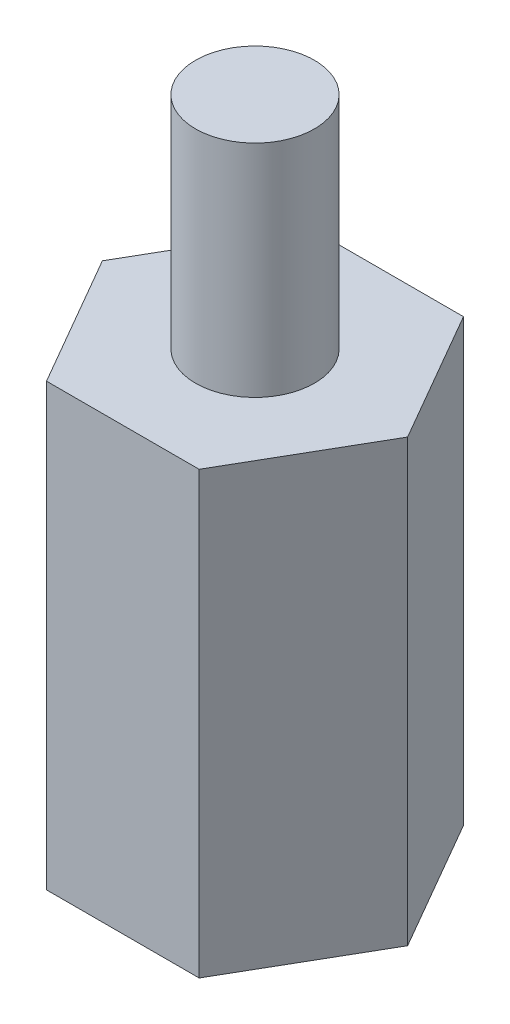
ISO-10303-21;
HEADER;
FILE_DESCRIPTION(('STEP AP214'),'2;1');
FILE_NAME('part.step','',(''),(''),'','','');
FILE_SCHEMA(('AUTOMOTIVE_DESIGN { 1 0 10303 214 1 1 1 1 }'));
ENDSEC;
DATA;
#1=APPLICATION_CONTEXT('core data for automotive mechanical design processes');
#2=APPLICATION_PROTOCOL_DEFINITION('international standard','automotive_design',2000,#1);
#3=PRODUCT_CONTEXT('',#1,'mechanical');
#4=PRODUCT('Part','Part','',(#3));
#5=PRODUCT_RELATED_PRODUCT_CATEGORY('part','',(#4));
#6=PRODUCT_DEFINITION_FORMATION('','',#4);
#7=PRODUCT_DEFINITION_CONTEXT('part definition',#1,'design');
#8=PRODUCT_DEFINITION('design','',#6,#7);
#9=PRODUCT_DEFINITION_SHAPE('','',#8);
#10=(LENGTH_UNIT() NAMED_UNIT(*) SI_UNIT(.MILLI.,.METRE.));
#11=(NAMED_UNIT(*) PLANE_ANGLE_UNIT() SI_UNIT($,.RADIAN.));
#12=(NAMED_UNIT(*) SI_UNIT($,.STERADIAN.) SOLID_ANGLE_UNIT());
#13=UNCERTAINTY_MEASURE_WITH_UNIT(LENGTH_MEASURE(1.E-05),#10,'distance_accuracy_value','');
#14=(GEOMETRIC_REPRESENTATION_CONTEXT(3) GLOBAL_UNCERTAINTY_ASSIGNED_CONTEXT((#13)) GLOBAL_UNIT_ASSIGNED_CONTEXT((#10,
#11,#12)) REPRESENTATION_CONTEXT('',''));
#15=CARTESIAN_POINT('',(0.,0.,0.));
#16=DIRECTION('',(0.,0.,1.));
#17=DIRECTION('',(1.,0.,0.));
#18=AXIS2_PLACEMENT_3D('',#15,#16,#17);
#19=CARTESIAN_POINT('',(1.73205080756891,10.,2.99999999999998));
#20=DIRECTION('',(-0.866025403784442,0.,-0.499999999999995));
#21=DIRECTION('',(-0.499999999999995,0.,0.866025403784442));
#22=AXIS2_PLACEMENT_3D('',#19,#20,#21);
#23=PLANE('',#22);
#24=DIRECTION('',(0.499999999999995,0.,-0.866025403784442));
#25=VECTOR('',#24,1.);
#26=CARTESIAN_POINT('',(1.73205080756891,0.,2.99999999999998));
#27=LINE('',#26,#25);
#28=CARTESIAN_POINT('',(1.73205080756891,0.,2.99999999999998));
#29=VERTEX_POINT('',#28);
#30=CARTESIAN_POINT('',(3.46410161513776,0.,0.));
#31=VERTEX_POINT('',#30);
#32=EDGE_CURVE('E130',#29,#31,#27,.T.);
#33=ORIENTED_EDGE('',*,*,#32,.T.);
#34=DIRECTION('',(0.,-1.,0.));
#35=VECTOR('',#34,1.);
#36=CARTESIAN_POINT('',(3.46410161513776,10.,0.));
#37=LINE('',#36,#35);
#38=CARTESIAN_POINT('',(3.46410161513776,10.,0.));
#39=VERTEX_POINT('',#38);
#40=EDGE_CURVE('E42',#39,#31,#37,.T.);
#41=ORIENTED_EDGE('',*,*,#40,.F.);
#42=DIRECTION('',(0.499999999999995,0.,-0.866025403784442));
#43=VECTOR('',#42,1.);
#44=CARTESIAN_POINT('',(1.73205080756891,10.,2.99999999999998));
#45=LINE('',#44,#43);
#46=CARTESIAN_POINT('',(1.73205080756891,10.,2.99999999999998));
#47=VERTEX_POINT('',#46);
#48=EDGE_CURVE('E147',#47,#39,#45,.T.);
#49=ORIENTED_EDGE('',*,*,#48,.F.);
#50=DIRECTION('',(0.,-1.,0.));
#51=VECTOR('',#50,1.);
#52=CARTESIAN_POINT('',(1.73205080756891,10.,2.99999999999998));
#53=LINE('',#52,#51);
#54=EDGE_CURVE('E126',#47,#29,#53,.T.);
#55=ORIENTED_EDGE('',*,*,#54,.T.);
#56=EDGE_LOOP('',(#33,#41,#49,#55));
#57=FACE_BOUND('',#56,.T.);
#58=ADVANCED_FACE('F39',(#57),#23,.F.);
#59=CARTESIAN_POINT('',(3.46410161513776,10.,0.));
#60=DIRECTION('',(-0.866025403784438,0.,0.500000000000001));
#61=DIRECTION('',(0.500000000000001,0.,0.866025403784438));
#62=AXIS2_PLACEMENT_3D('',#59,#60,#61);
#63=PLANE('',#62);
#64=DIRECTION('',(-0.500000000000001,0.,-0.866025403784438));
#65=VECTOR('',#64,1.);
#66=CARTESIAN_POINT('',(3.46410161513776,0.,0.));
#67=LINE('',#66,#65);
#68=CARTESIAN_POINT('',(1.73205080756887,0.,-3.00000000000001));
#69=VERTEX_POINT('',#68);
#70=EDGE_CURVE('E134',#31,#69,#67,.T.);
#71=ORIENTED_EDGE('',*,*,#70,.T.);
#72=DIRECTION('',(0.,-1.,0.));
#73=VECTOR('',#72,1.);
#74=CARTESIAN_POINT('',(1.73205080756887,10.,-3.00000000000001));
#75=LINE('',#74,#73);
#76=CARTESIAN_POINT('',(1.73205080756887,10.,-3.00000000000001));
#77=VERTEX_POINT('',#76);
#78=EDGE_CURVE('E153',#77,#69,#75,.T.);
#79=ORIENTED_EDGE('',*,*,#78,.F.);
#80=DIRECTION('',(-0.500000000000001,0.,-0.866025403784438));
#81=VECTOR('',#80,1.);
#82=CARTESIAN_POINT('',(3.46410161513776,10.,0.));
#83=LINE('',#82,#81);
#84=EDGE_CURVE('E95',#39,#77,#83,.T.);
#85=ORIENTED_EDGE('',*,*,#84,.F.);
#86=ORIENTED_EDGE('',*,*,#40,.T.);
#87=EDGE_LOOP('',(#71,#79,#85,#86));
#88=FACE_BOUND('',#87,.T.);
#89=ADVANCED_FACE('F160',(#88),#63,.F.);
#90=CARTESIAN_POINT('',(1.73205080756887,10.,-3.00000000000001));
#91=DIRECTION('',(0.,0.,1.));
#92=DIRECTION('',(1.,0.,0.));
#93=AXIS2_PLACEMENT_3D('',#90,#91,#92);
#94=PLANE('',#93);
#95=DIRECTION('',(-1.,0.,0.));
#96=VECTOR('',#95,1.);
#97=CARTESIAN_POINT('',(1.73205080756887,0.,-3.00000000000001));
#98=LINE('',#97,#96);
#99=CARTESIAN_POINT('',(-1.73205080756889,0.,-2.99999999999999));
#100=VERTEX_POINT('',#99);
#101=EDGE_CURVE('E138',#69,#100,#98,.T.);
#102=ORIENTED_EDGE('',*,*,#101,.T.);
#103=DIRECTION('',(0.,-1.,0.));
#104=VECTOR('',#103,1.);
#105=CARTESIAN_POINT('',(-1.73205080756889,10.,-2.99999999999999));
#106=LINE('',#105,#104);
#107=CARTESIAN_POINT('',(-1.73205080756889,10.,-2.99999999999999));
#108=VERTEX_POINT('',#107);
#109=EDGE_CURVE('E119',#108,#100,#106,.T.);
#110=ORIENTED_EDGE('',*,*,#109,.F.);
#111=DIRECTION('',(-1.,0.,0.));
#112=VECTOR('',#111,1.);
#113=CARTESIAN_POINT('',(1.73205080756887,10.,-3.00000000000001));
#114=LINE('',#113,#112);
#115=EDGE_CURVE('E108',#77,#108,#114,.T.);
#116=ORIENTED_EDGE('',*,*,#115,.F.);
#117=ORIENTED_EDGE('',*,*,#78,.T.);
#118=EDGE_LOOP('',(#102,#110,#116,#117));
#119=FACE_BOUND('',#118,.T.);
#120=ADVANCED_FACE('F166',(#119),#94,.F.);
#121=CARTESIAN_POINT('',(-1.73205080756889,10.,-2.99999999999999));
#122=DIRECTION('',(0.866025403784442,0.,0.499999999999995));
#123=DIRECTION('',(0.499999999999995,0.,-0.866025403784442));
#124=AXIS2_PLACEMENT_3D('',#121,#122,#123);
#125=PLANE('',#124);
#126=DIRECTION('',(-0.499999999999995,0.,0.866025403784442));
#127=VECTOR('',#126,1.);
#128=CARTESIAN_POINT('',(-1.73205080756889,0.,-2.99999999999999));
#129=LINE('',#128,#127);
#130=CARTESIAN_POINT('',(-3.46410161513776,0.,0.));
#131=VERTEX_POINT('',#130);
#132=EDGE_CURVE('E117',#100,#131,#129,.T.);
#133=ORIENTED_EDGE('',*,*,#132,.T.);
#134=DIRECTION('',(0.,-1.,0.));
#135=VECTOR('',#134,1.);
#136=CARTESIAN_POINT('',(-3.46410161513776,10.,0.));
#137=LINE('',#136,#135);
#138=CARTESIAN_POINT('',(-3.46410161513776,10.,0.));
#139=VERTEX_POINT('',#138);
#140=EDGE_CURVE('E114',#139,#131,#137,.T.);
#141=ORIENTED_EDGE('',*,*,#140,.F.);
#142=DIRECTION('',(-0.499999999999995,0.,0.866025403784442));
#143=VECTOR('',#142,1.);
#144=CARTESIAN_POINT('',(-1.73205080756889,10.,-2.99999999999999));
#145=LINE('',#144,#143);
#146=EDGE_CURVE('E102',#108,#139,#145,.T.);
#147=ORIENTED_EDGE('',*,*,#146,.F.);
#148=ORIENTED_EDGE('',*,*,#109,.T.);
#149=EDGE_LOOP('',(#133,#141,#147,#148));
#150=FACE_BOUND('',#149,.T.);
#151=ADVANCED_FACE('F115',(#150),#125,.F.);
#152=CARTESIAN_POINT('',(-3.46410161513776,10.,0.));
#153=DIRECTION('',(0.866025403784435,0.,-0.500000000000007));
#154=DIRECTION('',(-0.500000000000007,0.,-0.866025403784435));
#155=AXIS2_PLACEMENT_3D('',#152,#153,#154);
#156=PLANE('',#155);
#157=DIRECTION('',(0.500000000000007,0.,0.866025403784434));
#158=VECTOR('',#157,1.);
#159=CARTESIAN_POINT('',(-3.46410161513776,0.,0.));
#160=LINE('',#159,#158);
#161=CARTESIAN_POINT('',(-1.73205080756885,0.,3.00000000000002));
#162=VERTEX_POINT('',#161);
#163=EDGE_CURVE('E80',#131,#162,#160,.T.);
#164=ORIENTED_EDGE('',*,*,#163,.T.);
#165=DIRECTION('',(0.,-1.,0.));
#166=VECTOR('',#165,1.);
#167=CARTESIAN_POINT('',(-1.73205080756885,10.,3.00000000000002));
#168=LINE('',#167,#166);
#169=CARTESIAN_POINT('',(-1.73205080756885,10.,3.00000000000002));
#170=VERTEX_POINT('',#169);
#171=EDGE_CURVE('E120',#170,#162,#168,.T.);
#172=ORIENTED_EDGE('',*,*,#171,.F.);
#173=DIRECTION('',(0.500000000000007,0.,0.866025403784434));
#174=VECTOR('',#173,1.);
#175=CARTESIAN_POINT('',(-3.46410161513776,10.,0.));
#176=LINE('',#175,#174);
#177=EDGE_CURVE('E106',#139,#170,#176,.T.);
#178=ORIENTED_EDGE('',*,*,#177,.F.);
#179=ORIENTED_EDGE('',*,*,#140,.T.);
#180=EDGE_LOOP('',(#164,#172,#178,#179));
#181=FACE_BOUND('',#180,.T.);
#182=ADVANCED_FACE('F122',(#181),#156,.F.);
#183=CARTESIAN_POINT('',(-1.73205080756885,10.,3.00000000000002));
#184=DIRECTION('',(0.,0.,-1.));
#185=DIRECTION('',(-1.,0.,0.));
#186=AXIS2_PLACEMENT_3D('',#183,#184,#185);
#187=PLANE('',#186);
#188=DIRECTION('',(1.,0.,0.));
#189=VECTOR('',#188,1.);
#190=CARTESIAN_POINT('',(-1.73205080756885,0.,3.00000000000002));
#191=LINE('',#190,#189);
#192=EDGE_CURVE('E86',#162,#29,#191,.T.);
#193=ORIENTED_EDGE('',*,*,#192,.T.);
#194=ORIENTED_EDGE('',*,*,#54,.F.);
#195=DIRECTION('',(1.,0.,0.));
#196=VECTOR('',#195,1.);
#197=CARTESIAN_POINT('',(-1.73205080756885,10.,3.00000000000002));
#198=LINE('',#197,#196);
#199=EDGE_CURVE('E57',#170,#47,#198,.T.);
#200=ORIENTED_EDGE('',*,*,#199,.F.);
#201=ORIENTED_EDGE('',*,*,#171,.T.);
#202=EDGE_LOOP('',(#193,#194,#200,#201));
#203=FACE_BOUND('',#202,.T.);
#204=ADVANCED_FACE('F203',(#203),#187,.F.);
#205=CARTESIAN_POINT('',(0.,10.,0.));
#206=DIRECTION('',(0.,1.,0.));
#207=DIRECTION('',(0.,0.,1.));
#208=AXIS2_PLACEMENT_3D('',#205,#206,#207);
#209=PLANE('',#208);
#210=CARTESIAN_POINT('',(0.,10.,0.));
#211=DIRECTION('',(0.,1.,0.));
#212=DIRECTION('',(0.,0.,1.));
#213=AXIS2_PLACEMENT_3D('',#210,#211,#212);
#214=CIRCLE('',#213,1.35);
#215=CARTESIAN_POINT('',(0.,10.,1.35));
#216=VERTEX_POINT('',#215);
#217=EDGE_CURVE('E11',#216,#216,#214,.T.);
#218=ORIENTED_EDGE('',*,*,#217,.F.);
#219=EDGE_LOOP('',(#218));
#220=FACE_BOUND('',#219,.T.);
#221=ORIENTED_EDGE('',*,*,#48,.T.);
#222=ORIENTED_EDGE('',*,*,#84,.T.);
#223=ORIENTED_EDGE('',*,*,#115,.T.);
#224=ORIENTED_EDGE('',*,*,#146,.T.);
#225=ORIENTED_EDGE('',*,*,#177,.T.);
#226=ORIENTED_EDGE('',*,*,#199,.T.);
#227=EDGE_LOOP('',(#221,#222,#223,#224,#225,#226));
#228=FACE_BOUND('',#227,.T.);
#229=ADVANCED_FACE('F104',(#220,#228),#209,.T.);
#230=CARTESIAN_POINT('',(0.,0.,0.));
#231=DIRECTION('',(0.,1.,0.));
#232=DIRECTION('',(0.,0.,1.));
#233=AXIS2_PLACEMENT_3D('',#230,#231,#232);
#234=PLANE('',#233);
#235=CARTESIAN_POINT('',(0.,0.,0.));
#236=DIRECTION('',(0.,-1.,0.));
#237=DIRECTION('',(0.,0.,-1.));
#238=AXIS2_PLACEMENT_3D('',#235,#236,#237);
#239=CIRCLE('',#238,1.35);
#240=CARTESIAN_POINT('',(0.,0.,-1.35));
#241=VERTEX_POINT('',#240);
#242=EDGE_CURVE('E177',#241,#241,#239,.T.);
#243=ORIENTED_EDGE('',*,*,#242,.F.);
#244=EDGE_LOOP('',(#243));
#245=FACE_BOUND('',#244,.T.);
#246=ORIENTED_EDGE('',*,*,#32,.F.);
#247=ORIENTED_EDGE('',*,*,#192,.F.);
#248=ORIENTED_EDGE('',*,*,#163,.F.);
#249=ORIENTED_EDGE('',*,*,#132,.F.);
#250=ORIENTED_EDGE('',*,*,#101,.F.);
#251=ORIENTED_EDGE('',*,*,#70,.F.);
#252=EDGE_LOOP('',(#246,#247,#248,#249,#250,#251));
#253=FACE_BOUND('',#252,.T.);
#254=ADVANCED_FACE('F165',(#245,#253),#234,.F.);
#255=CARTESIAN_POINT('',(0.,15.,0.));
#256=DIRECTION('',(0.,-1.,0.));
#257=DIRECTION('',(0.,0.,-1.));
#258=AXIS2_PLACEMENT_3D('',#255,#256,#257);
#259=CYLINDRICAL_SURFACE('',#258,1.35);
#260=CARTESIAN_POINT('',(0.,15.,0.));
#261=DIRECTION('',(0.,1.,0.));
#262=DIRECTION('',(0.,0.,1.));
#263=AXIS2_PLACEMENT_3D('',#260,#261,#262);
#264=CIRCLE('',#263,1.35);
#265=CARTESIAN_POINT('',(0.,15.,1.35));
#266=VERTEX_POINT('',#265);
#267=EDGE_CURVE('E135',#266,#266,#264,.T.);
#268=ORIENTED_EDGE('',*,*,#267,.F.);
#269=EDGE_LOOP('',(#268));
#270=FACE_BOUND('',#269,.T.);
#271=ORIENTED_EDGE('',*,*,#217,.T.);
#272=EDGE_LOOP('',(#271));
#273=FACE_BOUND('',#272,.T.);
#274=ADVANCED_FACE('F195',(#270,#273),#259,.T.);
#275=CARTESIAN_POINT('',(0.,15.,0.));
#276=DIRECTION('',(0.,1.,0.));
#277=DIRECTION('',(0.,0.,1.));
#278=AXIS2_PLACEMENT_3D('',#275,#276,#277);
#279=PLANE('',#278);
#280=ORIENTED_EDGE('',*,*,#267,.T.);
#281=EDGE_LOOP('',(#280));
#282=FACE_BOUND('',#281,.T.);
#283=ADVANCED_FACE('F190',(#282),#279,.T.);
#284=CARTESIAN_POINT('',(0.,6.,0.));
#285=DIRECTION('',(0.,-1.,0.));
#286=DIRECTION('',(0.,0.,-1.));
#287=AXIS2_PLACEMENT_3D('',#284,#285,#286);
#288=CYLINDRICAL_SURFACE('',#287,1.35);
#289=CARTESIAN_POINT('',(0.,6.,0.));
#290=DIRECTION('',(0.,-1.,0.));
#291=DIRECTION('',(0.,0.,-1.));
#292=AXIS2_PLACEMENT_3D('',#289,#290,#291);
#293=CIRCLE('',#292,1.35);
#294=CARTESIAN_POINT('',(0.,6.,-1.35));
#295=VERTEX_POINT('',#294);
#296=EDGE_CURVE('E176',#295,#295,#293,.T.);
#297=ORIENTED_EDGE('',*,*,#296,.F.);
#298=EDGE_LOOP('',(#297));
#299=FACE_BOUND('',#298,.T.);
#300=ORIENTED_EDGE('',*,*,#242,.T.);
#301=EDGE_LOOP('',(#300));
#302=FACE_BOUND('',#301,.T.);
#303=ADVANCED_FACE('F187',(#299,#302),#288,.F.);
#304=CARTESIAN_POINT('',(0.,6.,0.));
#305=DIRECTION('',(0.,-1.,0.));
#306=DIRECTION('',(0.,0.,-1.));
#307=AXIS2_PLACEMENT_3D('',#304,#305,#306);
#308=PLANE('',#307);
#309=ORIENTED_EDGE('',*,*,#296,.T.);
#310=EDGE_LOOP('',(#309));
#311=FACE_BOUND('',#310,.T.);
#312=ADVANCED_FACE('F185',(#311),#308,.T.);
#313=CLOSED_SHELL('',(#58,#89,#120,#151,#182,#204,#229,#254,#274,#283,#303,#312));
#314=MANIFOLD_SOLID_BREP('B2',#313);
#315=ADVANCED_BREP_SHAPE_REPRESENTATION('',(#18,#314),#14);
#316=SHAPE_DEFINITION_REPRESENTATION(#9,#315);
ENDSEC;
END-ISO-10303-21;
